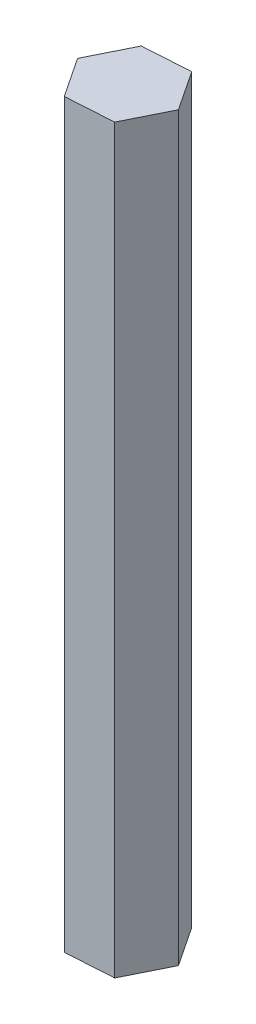
ISO-10303-21;
HEADER;
FILE_DESCRIPTION(('STEP AP214'),'2;1');
FILE_NAME('part.step','',(''),(''),'','','');
FILE_SCHEMA(('AUTOMOTIVE_DESIGN { 1 0 10303 214 1 1 1 1 }'));
ENDSEC;
DATA;
#1=APPLICATION_CONTEXT('core data for automotive mechanical design processes');
#2=APPLICATION_PROTOCOL_DEFINITION('international standard','automotive_design',2000,#1);
#3=PRODUCT_CONTEXT('',#1,'mechanical');
#4=PRODUCT('Part','Part','',(#3));
#5=PRODUCT_RELATED_PRODUCT_CATEGORY('part','',(#4));
#6=PRODUCT_DEFINITION_FORMATION('','',#4);
#7=PRODUCT_DEFINITION_CONTEXT('part definition',#1,'design');
#8=PRODUCT_DEFINITION('design','',#6,#7);
#9=PRODUCT_DEFINITION_SHAPE('','',#8);
#10=(LENGTH_UNIT() NAMED_UNIT(*) SI_UNIT(.MILLI.,.METRE.));
#11=(NAMED_UNIT(*) PLANE_ANGLE_UNIT() SI_UNIT($,.RADIAN.));
#12=(NAMED_UNIT(*) SI_UNIT($,.STERADIAN.) SOLID_ANGLE_UNIT());
#13=UNCERTAINTY_MEASURE_WITH_UNIT(LENGTH_MEASURE(1.E-05),#10,'distance_accuracy_value','');
#14=(GEOMETRIC_REPRESENTATION_CONTEXT(3) GLOBAL_UNCERTAINTY_ASSIGNED_CONTEXT((#13)) GLOBAL_UNIT_ASSIGNED_CONTEXT((#10,
#11,#12)) REPRESENTATION_CONTEXT('',''));
#15=CARTESIAN_POINT('',(0.,0.,0.));
#16=DIRECTION('',(0.,0.,1.));
#17=DIRECTION('',(1.,0.,0.));
#18=AXIS2_PLACEMENT_3D('',#15,#16,#17);
#19=CARTESIAN_POINT('',(7.31785977013899,114.3,-0.460718697162052));
#20=DIRECTION('',(-0.832897288147061,0.,0.553427599056346));
#21=DIRECTION('',(0.553427599056346,0.,0.832897288147061));
#22=AXIS2_PLACEMENT_3D('',#19,#20,#21);
#23=PLANE('',#22);
#24=DIRECTION('',(-0.553427599056346,0.,-0.832897288147061));
#25=VECTOR('',#24,1.);
#26=CARTESIAN_POINT('',(7.31785977013899,0.,-0.460718697162052));
#27=LINE('',#26,#25);
#28=CARTESIAN_POINT('',(7.31785977013899,0.,-0.460718697162052));
#29=VERTEX_POINT('',#28);
#30=CARTESIAN_POINT('',(3.25993578932869,0.,-6.56781181085354));
#31=VERTEX_POINT('',#30);
#32=EDGE_CURVE('E122',#29,#31,#27,.T.);
#33=ORIENTED_EDGE('',*,*,#32,.T.);
#34=DIRECTION('',(0.,-1.,0.));
#35=VECTOR('',#34,1.);
#36=CARTESIAN_POINT('',(3.25993578932869,114.3,-6.56781181085354));
#37=LINE('',#36,#35);
#38=CARTESIAN_POINT('',(3.25993578932869,114.3,-6.56781181085354));
#39=VERTEX_POINT('',#38);
#40=EDGE_CURVE('E11',#39,#31,#37,.T.);
#41=ORIENTED_EDGE('',*,*,#40,.F.);
#42=DIRECTION('',(-0.553427599056346,0.,-0.832897288147061));
#43=VECTOR('',#42,1.);
#44=CARTESIAN_POINT('',(7.31785977013899,114.3,-0.460718697162052));
#45=LINE('',#44,#43);
#46=CARTESIAN_POINT('',(7.31785977013899,114.3,-0.460718697162052));
#47=VERTEX_POINT('',#46);
#48=EDGE_CURVE('E132',#47,#39,#45,.T.);
#49=ORIENTED_EDGE('',*,*,#48,.F.);
#50=DIRECTION('',(0.,-1.,0.));
#51=VECTOR('',#50,1.);
#52=CARTESIAN_POINT('',(7.31785977013899,114.3,-0.460718697162052));
#53=LINE('',#52,#51);
#54=EDGE_CURVE('E118',#47,#29,#53,.T.);
#55=ORIENTED_EDGE('',*,*,#54,.T.);
#56=EDGE_LOOP('',(#33,#41,#49,#55));
#57=FACE_BOUND('',#56,.T.);
#58=ADVANCED_FACE('F38',(#57),#23,.F.);
#59=CARTESIAN_POINT('',(3.25993578932869,114.3,-6.56781181085354));
#60=DIRECTION('',(0.0628337158646939,0.,0.998024009806695));
#61=DIRECTION('',(0.998024009806695,0.,-0.0628337158646939));
#62=AXIS2_PLACEMENT_3D('',#59,#60,#61);
#63=PLANE('',#62);
#64=DIRECTION('',(-0.998024009806695,0.,0.0628337158646939));
#65=VECTOR('',#64,1.);
#66=CARTESIAN_POINT('',(3.25993578932869,0.,-6.56781181085354));
#67=LINE('',#66,#65);
#68=CARTESIAN_POINT('',(-4.0579239808103,0.,-6.10709311369149));
#69=VERTEX_POINT('',#68);
#70=EDGE_CURVE('E125',#31,#69,#67,.T.);
#71=ORIENTED_EDGE('',*,*,#70,.T.);
#72=DIRECTION('',(0.,-1.,0.));
#73=VECTOR('',#72,1.);
#74=CARTESIAN_POINT('',(-4.0579239808103,114.3,-6.10709311369149));
#75=LINE('',#74,#73);
#76=CARTESIAN_POINT('',(-4.0579239808103,114.3,-6.10709311369149));
#77=VERTEX_POINT('',#76);
#78=EDGE_CURVE('E46',#77,#69,#75,.T.);
#79=ORIENTED_EDGE('',*,*,#78,.F.);
#80=DIRECTION('',(-0.998024009806695,0.,0.0628337158646939));
#81=VECTOR('',#80,1.);
#82=CARTESIAN_POINT('',(3.25993578932869,114.3,-6.56781181085354));
#83=LINE('',#82,#81);
#84=EDGE_CURVE('E91',#39,#77,#83,.T.);
#85=ORIENTED_EDGE('',*,*,#84,.F.);
#86=ORIENTED_EDGE('',*,*,#40,.T.);
#87=EDGE_LOOP('',(#71,#79,#85,#86));
#88=FACE_BOUND('',#87,.T.);
#89=ADVANCED_FACE('F156',(#88),#63,.F.);
#90=CARTESIAN_POINT('',(-4.0579239808103,114.3,-6.10709311369149));
#91=DIRECTION('',(0.895731004011755,0.,0.444596410750349));
#92=DIRECTION('',(0.444596410750349,0.,-0.895731004011755));
#93=AXIS2_PLACEMENT_3D('',#90,#91,#92);
#94=PLANE('',#93);
#95=DIRECTION('',(-0.444596410750349,0.,0.895731004011755));
#96=VECTOR('',#95,1.);
#97=CARTESIAN_POINT('',(-4.0579239808103,0.,-6.10709311369149));
#98=LINE('',#97,#96);
#99=CARTESIAN_POINT('',(-7.31785977013899,0.,0.460718697162054));
#100=VERTEX_POINT('',#99);
#101=EDGE_CURVE('E127',#69,#100,#98,.T.);
#102=ORIENTED_EDGE('',*,*,#101,.T.);
#103=DIRECTION('',(0.,-1.,0.));
#104=VECTOR('',#103,1.);
#105=CARTESIAN_POINT('',(-7.31785977013899,114.3,0.460718697162054));
#106=LINE('',#105,#104);
#107=CARTESIAN_POINT('',(-7.31785977013899,114.3,0.460718697162054));
#108=VERTEX_POINT('',#107);
#109=EDGE_CURVE('E113',#108,#100,#106,.T.);
#110=ORIENTED_EDGE('',*,*,#109,.F.);
#111=DIRECTION('',(-0.444596410750349,0.,0.895731004011755));
#112=VECTOR('',#111,1.);
#113=CARTESIAN_POINT('',(-4.0579239808103,114.3,-6.10709311369149));
#114=LINE('',#113,#112);
#115=EDGE_CURVE('E104',#77,#108,#114,.T.);
#116=ORIENTED_EDGE('',*,*,#115,.F.);
#117=ORIENTED_EDGE('',*,*,#78,.T.);
#118=EDGE_LOOP('',(#102,#110,#116,#117));
#119=FACE_BOUND('',#118,.T.);
#120=ADVANCED_FACE('F138',(#119),#94,.F.);
#121=CARTESIAN_POINT('',(-7.31785977013899,114.3,0.460718697162054));
#122=DIRECTION('',(0.832897288147061,0.,-0.553427599056346));
#123=DIRECTION('',(-0.553427599056346,0.,-0.832897288147061));
#124=AXIS2_PLACEMENT_3D('',#121,#122,#123);
#125=PLANE('',#124);
#126=DIRECTION('',(0.553427599056346,0.,0.832897288147061));
#127=VECTOR('',#126,1.);
#128=CARTESIAN_POINT('',(-7.31785977013899,0.,0.460718697162054));
#129=LINE('',#128,#127);
#130=CARTESIAN_POINT('',(-3.25993578932868,0.,6.56781181085354));
#131=VERTEX_POINT('',#130);
#132=EDGE_CURVE('E112',#100,#131,#129,.T.);
#133=ORIENTED_EDGE('',*,*,#132,.T.);
#134=DIRECTION('',(0.,-1.,0.));
#135=VECTOR('',#134,1.);
#136=CARTESIAN_POINT('',(-3.25993578932868,114.3,6.56781181085354));
#137=LINE('',#136,#135);
#138=CARTESIAN_POINT('',(-3.25993578932868,114.3,6.56781181085354));
#139=VERTEX_POINT('',#138);
#140=EDGE_CURVE('E109',#139,#131,#137,.T.);
#141=ORIENTED_EDGE('',*,*,#140,.F.);
#142=DIRECTION('',(0.553427599056346,0.,0.832897288147061));
#143=VECTOR('',#142,1.);
#144=CARTESIAN_POINT('',(-7.31785977013899,114.3,0.460718697162054));
#145=LINE('',#144,#143);
#146=EDGE_CURVE('E98',#108,#139,#145,.T.);
#147=ORIENTED_EDGE('',*,*,#146,.F.);
#148=ORIENTED_EDGE('',*,*,#109,.T.);
#149=EDGE_LOOP('',(#133,#141,#147,#148));
#150=FACE_BOUND('',#149,.T.);
#151=ADVANCED_FACE('F110',(#150),#125,.F.);
#152=CARTESIAN_POINT('',(-3.25993578932868,114.3,6.56781181085354));
#153=DIRECTION('',(-0.0628337158646941,0.,-0.998024009806696));
#154=DIRECTION('',(-0.998024009806695,0.,0.062833715864694));
#155=AXIS2_PLACEMENT_3D('',#152,#153,#154);
#156=PLANE('',#155);
#157=DIRECTION('',(0.998024009806695,0.,-0.062833715864694));
#158=VECTOR('',#157,1.);
#159=CARTESIAN_POINT('',(-3.25993578932868,0.,6.56781181085354));
#160=LINE('',#159,#158);
#161=CARTESIAN_POINT('',(4.0579239808103,0.,6.10709311369149));
#162=VERTEX_POINT('',#161);
#163=EDGE_CURVE('E77',#131,#162,#160,.T.);
#164=ORIENTED_EDGE('',*,*,#163,.T.);
#165=DIRECTION('',(0.,-1.,0.));
#166=VECTOR('',#165,1.);
#167=CARTESIAN_POINT('',(4.0579239808103,114.3,6.10709311369149));
#168=LINE('',#167,#166);
#169=CARTESIAN_POINT('',(4.0579239808103,114.3,6.10709311369149));
#170=VERTEX_POINT('',#169);
#171=EDGE_CURVE('E114',#170,#162,#168,.T.);
#172=ORIENTED_EDGE('',*,*,#171,.F.);
#173=DIRECTION('',(0.998024009806695,0.,-0.062833715864694));
#174=VECTOR('',#173,1.);
#175=CARTESIAN_POINT('',(-3.25993578932868,114.3,6.56781181085354));
#176=LINE('',#175,#174);
#177=EDGE_CURVE('E102',#139,#170,#176,.T.);
#178=ORIENTED_EDGE('',*,*,#177,.F.);
#179=ORIENTED_EDGE('',*,*,#140,.T.);
#180=EDGE_LOOP('',(#164,#172,#178,#179));
#181=FACE_BOUND('',#180,.T.);
#182=ADVANCED_FACE('F116',(#181),#156,.F.);
#183=CARTESIAN_POINT('',(4.0579239808103,114.3,6.10709311369149));
#184=DIRECTION('',(-0.895731004011755,0.,-0.444596410750349));
#185=DIRECTION('',(-0.444596410750349,0.,0.895731004011755));
#186=AXIS2_PLACEMENT_3D('',#183,#184,#185);
#187=PLANE('',#186);
#188=DIRECTION('',(0.444596410750349,0.,-0.895731004011755));
#189=VECTOR('',#188,1.);
#190=CARTESIAN_POINT('',(4.0579239808103,0.,6.10709311369149));
#191=LINE('',#190,#189);
#192=EDGE_CURVE('E83',#162,#29,#191,.T.);
#193=ORIENTED_EDGE('',*,*,#192,.T.);
#194=ORIENTED_EDGE('',*,*,#54,.F.);
#195=DIRECTION('',(0.444596410750349,0.,-0.895731004011755));
#196=VECTOR('',#195,1.);
#197=CARTESIAN_POINT('',(4.0579239808103,114.3,6.10709311369149));
#198=LINE('',#197,#196);
#199=EDGE_CURVE('E54',#170,#47,#198,.T.);
#200=ORIENTED_EDGE('',*,*,#199,.F.);
#201=ORIENTED_EDGE('',*,*,#171,.T.);
#202=EDGE_LOOP('',(#193,#194,#200,#201));
#203=FACE_BOUND('',#202,.T.);
#204=ADVANCED_FACE('F145',(#203),#187,.F.);
#205=CARTESIAN_POINT('',(0.,114.3,0.));
#206=DIRECTION('',(0.,1.,0.));
#207=DIRECTION('',(0.,0.,1.));
#208=AXIS2_PLACEMENT_3D('',#205,#206,#207);
#209=PLANE('',#208);
#210=ORIENTED_EDGE('',*,*,#48,.T.);
#211=ORIENTED_EDGE('',*,*,#84,.T.);
#212=ORIENTED_EDGE('',*,*,#115,.T.);
#213=ORIENTED_EDGE('',*,*,#146,.T.);
#214=ORIENTED_EDGE('',*,*,#177,.T.);
#215=ORIENTED_EDGE('',*,*,#199,.T.);
#216=EDGE_LOOP('',(#210,#211,#212,#213,#214,#215));
#217=FACE_BOUND('',#216,.T.);
#218=ADVANCED_FACE('F100',(#217),#209,.T.);
#219=CARTESIAN_POINT('',(0.,0.,0.));
#220=DIRECTION('',(0.,1.,0.));
#221=DIRECTION('',(0.,0.,1.));
#222=AXIS2_PLACEMENT_3D('',#219,#220,#221);
#223=PLANE('',#222);
#224=ORIENTED_EDGE('',*,*,#32,.F.);
#225=ORIENTED_EDGE('',*,*,#192,.F.);
#226=ORIENTED_EDGE('',*,*,#163,.F.);
#227=ORIENTED_EDGE('',*,*,#132,.F.);
#228=ORIENTED_EDGE('',*,*,#101,.F.);
#229=ORIENTED_EDGE('',*,*,#70,.F.);
#230=EDGE_LOOP('',(#224,#225,#226,#227,#228,#229));
#231=FACE_BOUND('',#230,.T.);
#232=ADVANCED_FACE('F141',(#231),#223,.F.);
#233=CLOSED_SHELL('',(#58,#89,#120,#151,#182,#204,#218,#232));
#234=MANIFOLD_SOLID_BREP('B2',#233);
#235=ADVANCED_BREP_SHAPE_REPRESENTATION('',(#18,#234),#14);
#236=SHAPE_DEFINITION_REPRESENTATION(#9,#235);
ENDSEC;
END-ISO-10303-21;
